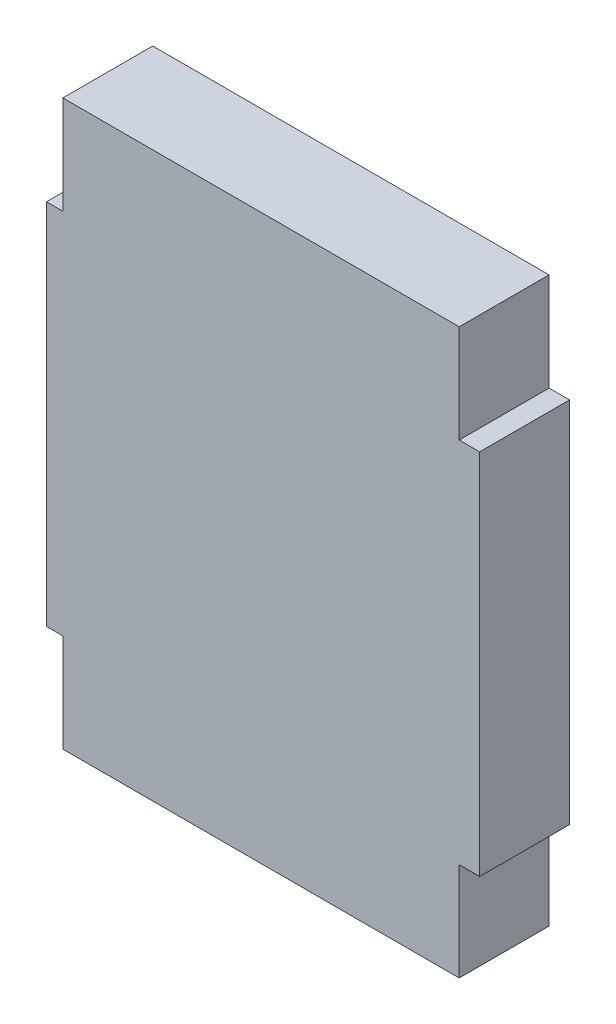
ISO-10303-21;
HEADER;
FILE_DESCRIPTION(('STEP AP214'),'2;1');
FILE_NAME('part.step','',(''),(''),'','','');
FILE_SCHEMA(('AUTOMOTIVE_DESIGN { 1 0 10303 214 1 1 1 1 }'));
ENDSEC;
DATA;
#1=APPLICATION_CONTEXT('core data for automotive mechanical design processes');
#2=APPLICATION_PROTOCOL_DEFINITION('international standard','automotive_design',2000,#1);
#3=PRODUCT_CONTEXT('',#1,'mechanical');
#4=PRODUCT('Part','Part','',(#3));
#5=PRODUCT_RELATED_PRODUCT_CATEGORY('part','',(#4));
#6=PRODUCT_DEFINITION_FORMATION('','',#4);
#7=PRODUCT_DEFINITION_CONTEXT('part definition',#1,'design');
#8=PRODUCT_DEFINITION('design','',#6,#7);
#9=PRODUCT_DEFINITION_SHAPE('','',#8);
#10=(LENGTH_UNIT() NAMED_UNIT(*) SI_UNIT(.MILLI.,.METRE.));
#11=(NAMED_UNIT(*) PLANE_ANGLE_UNIT() SI_UNIT($,.RADIAN.));
#12=(NAMED_UNIT(*) SI_UNIT($,.STERADIAN.) SOLID_ANGLE_UNIT());
#13=UNCERTAINTY_MEASURE_WITH_UNIT(LENGTH_MEASURE(1.E-05),#10,'distance_accuracy_value','');
#14=(GEOMETRIC_REPRESENTATION_CONTEXT(3) GLOBAL_UNCERTAINTY_ASSIGNED_CONTEXT((#13)) GLOBAL_UNIT_ASSIGNED_CONTEXT((#10,
#11,#12)) REPRESENTATION_CONTEXT('',''));
#15=CARTESIAN_POINT('',(0.,0.,0.));
#16=DIRECTION('',(0.,0.,1.));
#17=DIRECTION('',(1.,0.,0.));
#18=AXIS2_PLACEMENT_3D('',#15,#16,#17);
#19=CARTESIAN_POINT('',(2.675,2.25,1.1));
#20=DIRECTION('',(-1.,0.,0.));
#21=DIRECTION('',(0.,0.,1.));
#22=AXIS2_PLACEMENT_3D('',#19,#20,#21);
#23=PLANE('',#22);
#24=DIRECTION('',(0.,1.,0.));
#25=VECTOR('',#24,1.);
#26=CARTESIAN_POINT('',(2.675,2.25,0.));
#27=LINE('',#26,#25);
#28=CARTESIAN_POINT('',(2.675,-2.25,0.));
#29=VERTEX_POINT('',#28);
#30=CARTESIAN_POINT('',(2.675,2.25,0.));
#31=VERTEX_POINT('',#30);
#32=EDGE_CURVE('E154',#29,#31,#27,.T.);
#33=ORIENTED_EDGE('',*,*,#32,.T.);
#34=DIRECTION('',(0.,0.,-1.));
#35=VECTOR('',#34,1.);
#36=CARTESIAN_POINT('',(2.675,2.25,1.1));
#37=LINE('',#36,#35);
#38=CARTESIAN_POINT('',(2.675,2.25,1.1));
#39=VERTEX_POINT('',#38);
#40=EDGE_CURVE('E11',#39,#31,#37,.T.);
#41=ORIENTED_EDGE('',*,*,#40,.F.);
#42=DIRECTION('',(0.,1.,0.));
#43=VECTOR('',#42,1.);
#44=CARTESIAN_POINT('',(2.675,2.25,1.1));
#45=LINE('',#44,#43);
#46=CARTESIAN_POINT('',(2.675,-2.25,1.1));
#47=VERTEX_POINT('',#46);
#48=EDGE_CURVE('E176',#47,#39,#45,.T.);
#49=ORIENTED_EDGE('',*,*,#48,.F.);
#50=DIRECTION('',(0.,0.,-1.));
#51=VECTOR('',#50,1.);
#52=CARTESIAN_POINT('',(2.675,-2.25,1.1));
#53=LINE('',#52,#51);
#54=EDGE_CURVE('E150',#47,#29,#53,.T.);
#55=ORIENTED_EDGE('',*,*,#54,.T.);
#56=EDGE_LOOP('',(#33,#41,#49,#55));
#57=FACE_BOUND('',#56,.T.);
#58=ADVANCED_FACE('F34',(#57),#23,.F.);
#59=CARTESIAN_POINT('',(2.425,2.25,1.1));
#60=DIRECTION('',(0.,-1.,0.));
#61=DIRECTION('',(0.,0.,-1.));
#62=AXIS2_PLACEMENT_3D('',#59,#60,#61);
#63=PLANE('',#62);
#64=DIRECTION('',(-1.,0.,0.));
#65=VECTOR('',#64,1.);
#66=CARTESIAN_POINT('',(2.425,2.25,0.));
#67=LINE('',#66,#65);
#68=CARTESIAN_POINT('',(2.425,2.25,0.));
#69=VERTEX_POINT('',#68);
#70=EDGE_CURVE('E157',#31,#69,#67,.T.);
#71=ORIENTED_EDGE('',*,*,#70,.T.);
#72=DIRECTION('',(0.,0.,-1.));
#73=VECTOR('',#72,1.);
#74=CARTESIAN_POINT('',(2.425,2.25,1.1));
#75=LINE('',#74,#73);
#76=CARTESIAN_POINT('',(2.425,2.25,1.1));
#77=VERTEX_POINT('',#76);
#78=EDGE_CURVE('E42',#77,#69,#75,.T.);
#79=ORIENTED_EDGE('',*,*,#78,.F.);
#80=DIRECTION('',(-1.,0.,0.));
#81=VECTOR('',#80,1.);
#82=CARTESIAN_POINT('',(2.425,2.25,1.1));
#83=LINE('',#82,#81);
#84=EDGE_CURVE('E105',#39,#77,#83,.T.);
#85=ORIENTED_EDGE('',*,*,#84,.F.);
#86=ORIENTED_EDGE('',*,*,#40,.T.);
#87=EDGE_LOOP('',(#71,#79,#85,#86));
#88=FACE_BOUND('',#87,.T.);
#89=ADVANCED_FACE('F254',(#88),#63,.F.);
#90=CARTESIAN_POINT('',(2.425,3.45,1.1));
#91=DIRECTION('',(-1.,0.,0.));
#92=DIRECTION('',(0.,0.,1.));
#93=AXIS2_PLACEMENT_3D('',#90,#91,#92);
#94=PLANE('',#93);
#95=DIRECTION('',(0.,1.,0.));
#96=VECTOR('',#95,1.);
#97=CARTESIAN_POINT('',(2.425,3.45,0.));
#98=LINE('',#97,#96);
#99=CARTESIAN_POINT('',(2.425,3.45,0.));
#100=VERTEX_POINT('',#99);
#101=EDGE_CURVE('E159',#69,#100,#98,.T.);
#102=ORIENTED_EDGE('',*,*,#101,.T.);
#103=DIRECTION('',(0.,0.,-1.));
#104=VECTOR('',#103,1.);
#105=CARTESIAN_POINT('',(2.425,3.45,1.1));
#106=LINE('',#105,#104);
#107=CARTESIAN_POINT('',(2.425,3.45,1.1));
#108=VERTEX_POINT('',#107);
#109=EDGE_CURVE('E195',#108,#100,#106,.T.);
#110=ORIENTED_EDGE('',*,*,#109,.F.);
#111=DIRECTION('',(0.,1.,0.));
#112=VECTOR('',#111,1.);
#113=CARTESIAN_POINT('',(2.425,3.45,1.1));
#114=LINE('',#113,#112);
#115=EDGE_CURVE('E203',#77,#108,#114,.T.);
#116=ORIENTED_EDGE('',*,*,#115,.F.);
#117=ORIENTED_EDGE('',*,*,#78,.T.);
#118=EDGE_LOOP('',(#102,#110,#116,#117));
#119=FACE_BOUND('',#118,.T.);
#120=ADVANCED_FACE('F201',(#119),#94,.F.);
#121=CARTESIAN_POINT('',(-2.425,3.45,1.1));
#122=DIRECTION('',(0.,-1.,0.));
#123=DIRECTION('',(0.,0.,-1.));
#124=AXIS2_PLACEMENT_3D('',#121,#122,#123);
#125=PLANE('',#124);
#126=DIRECTION('',(-1.,0.,0.));
#127=VECTOR('',#126,1.);
#128=CARTESIAN_POINT('',(-2.425,3.45,0.));
#129=LINE('',#128,#127);
#130=CARTESIAN_POINT('',(-2.425,3.45,0.));
#131=VERTEX_POINT('',#130);
#132=EDGE_CURVE('E161',#100,#131,#129,.T.);
#133=ORIENTED_EDGE('',*,*,#132,.T.);
#134=DIRECTION('',(0.,0.,-1.));
#135=VECTOR('',#134,1.);
#136=CARTESIAN_POINT('',(-2.425,3.45,1.1));
#137=LINE('',#136,#135);
#138=CARTESIAN_POINT('',(-2.425,3.45,1.1));
#139=VERTEX_POINT('',#138);
#140=EDGE_CURVE('E192',#139,#131,#137,.T.);
#141=ORIENTED_EDGE('',*,*,#140,.F.);
#142=DIRECTION('',(-1.,0.,0.));
#143=VECTOR('',#142,1.);
#144=CARTESIAN_POINT('',(-2.425,3.45,1.1));
#145=LINE('',#144,#143);
#146=EDGE_CURVE('E221',#108,#139,#145,.T.);
#147=ORIENTED_EDGE('',*,*,#146,.F.);
#148=ORIENTED_EDGE('',*,*,#109,.T.);
#149=EDGE_LOOP('',(#133,#141,#147,#148));
#150=FACE_BOUND('',#149,.T.);
#151=ADVANCED_FACE('F212',(#150),#125,.F.);
#152=CARTESIAN_POINT('',(-2.425,2.25,1.1));
#153=DIRECTION('',(1.,0.,0.));
#154=DIRECTION('',(0.,0.,-1.));
#155=AXIS2_PLACEMENT_3D('',#152,#153,#154);
#156=PLANE('',#155);
#157=DIRECTION('',(0.,-1.,0.));
#158=VECTOR('',#157,1.);
#159=CARTESIAN_POINT('',(-2.425,2.25,0.));
#160=LINE('',#159,#158);
#161=CARTESIAN_POINT('',(-2.425,2.25,0.));
#162=VERTEX_POINT('',#161);
#163=EDGE_CURVE('E163',#131,#162,#160,.T.);
#164=ORIENTED_EDGE('',*,*,#163,.T.);
#165=DIRECTION('',(0.,0.,-1.));
#166=VECTOR('',#165,1.);
#167=CARTESIAN_POINT('',(-2.425,2.25,1.1));
#168=LINE('',#167,#166);
#169=CARTESIAN_POINT('',(-2.425,2.25,1.1));
#170=VERTEX_POINT('',#169);
#171=EDGE_CURVE('E189',#170,#162,#168,.T.);
#172=ORIENTED_EDGE('',*,*,#171,.F.);
#173=DIRECTION('',(0.,-1.,0.));
#174=VECTOR('',#173,1.);
#175=CARTESIAN_POINT('',(-2.425,2.25,1.1));
#176=LINE('',#175,#174);
#177=EDGE_CURVE('E218',#139,#170,#176,.T.);
#178=ORIENTED_EDGE('',*,*,#177,.F.);
#179=ORIENTED_EDGE('',*,*,#140,.T.);
#180=EDGE_LOOP('',(#164,#172,#178,#179));
#181=FACE_BOUND('',#180,.T.);
#182=ADVANCED_FACE('F216',(#181),#156,.F.);
#183=CARTESIAN_POINT('',(-2.625,2.25,1.1));
#184=DIRECTION('',(0.,-1.,0.));
#185=DIRECTION('',(0.,0.,-1.));
#186=AXIS2_PLACEMENT_3D('',#183,#184,#185);
#187=PLANE('',#186);
#188=DIRECTION('',(-1.,0.,0.));
#189=VECTOR('',#188,1.);
#190=CARTESIAN_POINT('',(-2.625,2.25,0.));
#191=LINE('',#190,#189);
#192=CARTESIAN_POINT('',(-2.625,2.25,0.));
#193=VERTEX_POINT('',#192);
#194=EDGE_CURVE('E165',#162,#193,#191,.T.);
#195=ORIENTED_EDGE('',*,*,#194,.T.);
#196=DIRECTION('',(0.,0.,-1.));
#197=VECTOR('',#196,1.);
#198=CARTESIAN_POINT('',(-2.625,2.25,1.1));
#199=LINE('',#198,#197);
#200=CARTESIAN_POINT('',(-2.625,2.25,1.1));
#201=VERTEX_POINT('',#200);
#202=EDGE_CURVE('E186',#201,#193,#199,.T.);
#203=ORIENTED_EDGE('',*,*,#202,.F.);
#204=DIRECTION('',(-1.,0.,0.));
#205=VECTOR('',#204,1.);
#206=CARTESIAN_POINT('',(-2.625,2.25,1.1));
#207=LINE('',#206,#205);
#208=EDGE_CURVE('E220',#170,#201,#207,.T.);
#209=ORIENTED_EDGE('',*,*,#208,.F.);
#210=ORIENTED_EDGE('',*,*,#171,.T.);
#211=EDGE_LOOP('',(#195,#203,#209,#210));
#212=FACE_BOUND('',#211,.T.);
#213=ADVANCED_FACE('F267',(#212),#187,.F.);
#214=CARTESIAN_POINT('',(-2.625,-2.25,1.1));
#215=DIRECTION('',(1.,0.,0.));
#216=DIRECTION('',(0.,0.,-1.));
#217=AXIS2_PLACEMENT_3D('',#214,#215,#216);
#218=PLANE('',#217);
#219=DIRECTION('',(0.,-1.,0.));
#220=VECTOR('',#219,1.);
#221=CARTESIAN_POINT('',(-2.625,-2.25,0.));
#222=LINE('',#221,#220);
#223=CARTESIAN_POINT('',(-2.625,-2.25,0.));
#224=VERTEX_POINT('',#223);
#225=EDGE_CURVE('E167',#193,#224,#222,.T.);
#226=ORIENTED_EDGE('',*,*,#225,.T.);
#227=DIRECTION('',(0.,0.,-1.));
#228=VECTOR('',#227,1.);
#229=CARTESIAN_POINT('',(-2.625,-2.25,1.1));
#230=LINE('',#229,#228);
#231=CARTESIAN_POINT('',(-2.625,-2.25,1.1));
#232=VERTEX_POINT('',#231);
#233=EDGE_CURVE('E183',#232,#224,#230,.T.);
#234=ORIENTED_EDGE('',*,*,#233,.F.);
#235=DIRECTION('',(0.,-1.,0.));
#236=VECTOR('',#235,1.);
#237=CARTESIAN_POINT('',(-2.625,-2.25,1.1));
#238=LINE('',#237,#236);
#239=EDGE_CURVE('E223',#201,#232,#238,.T.);
#240=ORIENTED_EDGE('',*,*,#239,.F.);
#241=ORIENTED_EDGE('',*,*,#202,.T.);
#242=EDGE_LOOP('',(#226,#234,#240,#241));
#243=FACE_BOUND('',#242,.T.);
#244=ADVANCED_FACE('F270',(#243),#218,.F.);
#245=CARTESIAN_POINT('',(-2.425,-2.25,1.1));
#246=DIRECTION('',(0.,1.,0.));
#247=DIRECTION('',(0.,0.,1.));
#248=AXIS2_PLACEMENT_3D('',#245,#246,#247);
#249=PLANE('',#248);
#250=DIRECTION('',(1.,0.,0.));
#251=VECTOR('',#250,1.);
#252=CARTESIAN_POINT('',(-2.425,-2.25,0.));
#253=LINE('',#252,#251);
#254=CARTESIAN_POINT('',(-2.425,-2.25,0.));
#255=VERTEX_POINT('',#254);
#256=EDGE_CURVE('E169',#224,#255,#253,.T.);
#257=ORIENTED_EDGE('',*,*,#256,.T.);
#258=DIRECTION('',(0.,0.,-1.));
#259=VECTOR('',#258,1.);
#260=CARTESIAN_POINT('',(-2.425,-2.25,1.1));
#261=LINE('',#260,#259);
#262=CARTESIAN_POINT('',(-2.425,-2.25,1.1));
#263=VERTEX_POINT('',#262);
#264=EDGE_CURVE('E180',#263,#255,#261,.T.);
#265=ORIENTED_EDGE('',*,*,#264,.F.);
#266=DIRECTION('',(1.,0.,0.));
#267=VECTOR('',#266,1.);
#268=CARTESIAN_POINT('',(-2.425,-2.25,1.1));
#269=LINE('',#268,#267);
#270=EDGE_CURVE('E229',#232,#263,#269,.T.);
#271=ORIENTED_EDGE('',*,*,#270,.F.);
#272=ORIENTED_EDGE('',*,*,#233,.T.);
#273=EDGE_LOOP('',(#257,#265,#271,#272));
#274=FACE_BOUND('',#273,.T.);
#275=ADVANCED_FACE('F235',(#274),#249,.F.);
#276=CARTESIAN_POINT('',(-2.425,-3.45,1.1));
#277=DIRECTION('',(1.,0.,0.));
#278=DIRECTION('',(0.,0.,-1.));
#279=AXIS2_PLACEMENT_3D('',#276,#277,#278);
#280=PLANE('',#279);
#281=DIRECTION('',(0.,-1.,0.));
#282=VECTOR('',#281,1.);
#283=CARTESIAN_POINT('',(-2.425,-3.45,0.));
#284=LINE('',#283,#282);
#285=CARTESIAN_POINT('',(-2.425,-3.45,0.));
#286=VERTEX_POINT('',#285);
#287=EDGE_CURVE('E171',#255,#286,#284,.T.);
#288=ORIENTED_EDGE('',*,*,#287,.T.);
#289=DIRECTION('',(0.,0.,-1.));
#290=VECTOR('',#289,1.);
#291=CARTESIAN_POINT('',(-2.425,-3.45,1.1));
#292=LINE('',#291,#290);
#293=CARTESIAN_POINT('',(-2.425,-3.45,1.1));
#294=VERTEX_POINT('',#293);
#295=EDGE_CURVE('E145',#294,#286,#292,.T.);
#296=ORIENTED_EDGE('',*,*,#295,.F.);
#297=DIRECTION('',(0.,-1.,0.));
#298=VECTOR('',#297,1.);
#299=CARTESIAN_POINT('',(-2.425,-3.45,1.1));
#300=LINE('',#299,#298);
#301=EDGE_CURVE('E136',#263,#294,#300,.T.);
#302=ORIENTED_EDGE('',*,*,#301,.F.);
#303=ORIENTED_EDGE('',*,*,#264,.T.);
#304=EDGE_LOOP('',(#288,#296,#302,#303));
#305=FACE_BOUND('',#304,.T.);
#306=ADVANCED_FACE('F239',(#305),#280,.F.);
#307=CARTESIAN_POINT('',(2.425,-3.45,1.1));
#308=DIRECTION('',(0.,1.,0.));
#309=DIRECTION('',(0.,0.,1.));
#310=AXIS2_PLACEMENT_3D('',#307,#308,#309);
#311=PLANE('',#310);
#312=DIRECTION('',(1.,0.,0.));
#313=VECTOR('',#312,1.);
#314=CARTESIAN_POINT('',(2.425,-3.45,0.));
#315=LINE('',#314,#313);
#316=CARTESIAN_POINT('',(2.425,-3.45,0.));
#317=VERTEX_POINT('',#316);
#318=EDGE_CURVE('E144',#286,#317,#315,.T.);
#319=ORIENTED_EDGE('',*,*,#318,.T.);
#320=DIRECTION('',(0.,0.,-1.));
#321=VECTOR('',#320,1.);
#322=CARTESIAN_POINT('',(2.425,-3.45,1.1));
#323=LINE('',#322,#321);
#324=CARTESIAN_POINT('',(2.425,-3.45,1.1));
#325=VERTEX_POINT('',#324);
#326=EDGE_CURVE('E141',#325,#317,#323,.T.);
#327=ORIENTED_EDGE('',*,*,#326,.F.);
#328=DIRECTION('',(1.,0.,0.));
#329=VECTOR('',#328,1.);
#330=CARTESIAN_POINT('',(2.425,-3.45,1.1));
#331=LINE('',#330,#329);
#332=EDGE_CURVE('E130',#294,#325,#331,.T.);
#333=ORIENTED_EDGE('',*,*,#332,.F.);
#334=ORIENTED_EDGE('',*,*,#295,.T.);
#335=EDGE_LOOP('',(#319,#327,#333,#334));
#336=FACE_BOUND('',#335,.T.);
#337=ADVANCED_FACE('F142',(#336),#311,.F.);
#338=CARTESIAN_POINT('',(2.425,-2.25,1.1));
#339=DIRECTION('',(-1.,0.,0.));
#340=DIRECTION('',(0.,0.,1.));
#341=AXIS2_PLACEMENT_3D('',#338,#339,#340);
#342=PLANE('',#341);
#343=DIRECTION('',(0.,1.,0.));
#344=VECTOR('',#343,1.);
#345=CARTESIAN_POINT('',(2.425,-2.25,0.));
#346=LINE('',#345,#344);
#347=CARTESIAN_POINT('',(2.425,-2.25,0.));
#348=VERTEX_POINT('',#347);
#349=EDGE_CURVE('E91',#317,#348,#346,.T.);
#350=ORIENTED_EDGE('',*,*,#349,.T.);
#351=DIRECTION('',(0.,0.,-1.));
#352=VECTOR('',#351,1.);
#353=CARTESIAN_POINT('',(2.425,-2.25,1.1));
#354=LINE('',#353,#352);
#355=CARTESIAN_POINT('',(2.425,-2.25,1.1));
#356=VERTEX_POINT('',#355);
#357=EDGE_CURVE('E146',#356,#348,#354,.T.);
#358=ORIENTED_EDGE('',*,*,#357,.F.);
#359=DIRECTION('',(0.,1.,0.));
#360=VECTOR('',#359,1.);
#361=CARTESIAN_POINT('',(2.425,-2.25,1.1));
#362=LINE('',#361,#360);
#363=EDGE_CURVE('E134',#325,#356,#362,.T.);
#364=ORIENTED_EDGE('',*,*,#363,.F.);
#365=ORIENTED_EDGE('',*,*,#326,.T.);
#366=EDGE_LOOP('',(#350,#358,#364,#365));
#367=FACE_BOUND('',#366,.T.);
#368=ADVANCED_FACE('F148',(#367),#342,.F.);
#369=CARTESIAN_POINT('',(2.675,-2.25,1.1));
#370=DIRECTION('',(0.,1.,0.));
#371=DIRECTION('',(0.,0.,1.));
#372=AXIS2_PLACEMENT_3D('',#369,#370,#371);
#373=PLANE('',#372);
#374=DIRECTION('',(1.,0.,0.));
#375=VECTOR('',#374,1.);
#376=CARTESIAN_POINT('',(2.675,-2.25,0.));
#377=LINE('',#376,#375);
#378=EDGE_CURVE('E97',#348,#29,#377,.T.);
#379=ORIENTED_EDGE('',*,*,#378,.T.);
#380=ORIENTED_EDGE('',*,*,#54,.F.);
#381=DIRECTION('',(1.,0.,0.));
#382=VECTOR('',#381,1.);
#383=CARTESIAN_POINT('',(2.675,-2.25,1.1));
#384=LINE('',#383,#382);
#385=EDGE_CURVE('E50',#356,#47,#384,.T.);
#386=ORIENTED_EDGE('',*,*,#385,.F.);
#387=ORIENTED_EDGE('',*,*,#357,.T.);
#388=EDGE_LOOP('',(#379,#380,#386,#387));
#389=FACE_BOUND('',#388,.T.);
#390=ADVANCED_FACE('F243',(#389),#373,.F.);
#391=CARTESIAN_POINT('',(0.,0.,1.1));
#392=DIRECTION('',(0.,0.,-1.));
#393=DIRECTION('',(-1.,0.,0.));
#394=AXIS2_PLACEMENT_3D('',#391,#392,#393);
#395=PLANE('',#394);
#396=ORIENTED_EDGE('',*,*,#48,.T.);
#397=ORIENTED_EDGE('',*,*,#84,.T.);
#398=ORIENTED_EDGE('',*,*,#115,.T.);
#399=ORIENTED_EDGE('',*,*,#146,.T.);
#400=ORIENTED_EDGE('',*,*,#177,.T.);
#401=ORIENTED_EDGE('',*,*,#208,.T.);
#402=ORIENTED_EDGE('',*,*,#239,.T.);
#403=ORIENTED_EDGE('',*,*,#270,.T.);
#404=ORIENTED_EDGE('',*,*,#301,.T.);
#405=ORIENTED_EDGE('',*,*,#332,.T.);
#406=ORIENTED_EDGE('',*,*,#363,.T.);
#407=ORIENTED_EDGE('',*,*,#385,.T.);
#408=EDGE_LOOP('',(#396,#397,#398,#399,#400,#401,#402,#403,#404,#405,#406,#407));
#409=FACE_BOUND('',#408,.T.);
#410=ADVANCED_FACE('F132',(#409),#395,.F.);
#411=CARTESIAN_POINT('',(0.,0.,0.));
#412=DIRECTION('',(0.,0.,-1.));
#413=DIRECTION('',(-1.,0.,0.));
#414=AXIS2_PLACEMENT_3D('',#411,#412,#413);
#415=PLANE('',#414);
#416=ORIENTED_EDGE('',*,*,#32,.F.);
#417=ORIENTED_EDGE('',*,*,#378,.F.);
#418=ORIENTED_EDGE('',*,*,#349,.F.);
#419=ORIENTED_EDGE('',*,*,#318,.F.);
#420=ORIENTED_EDGE('',*,*,#287,.F.);
#421=ORIENTED_EDGE('',*,*,#256,.F.);
#422=ORIENTED_EDGE('',*,*,#225,.F.);
#423=ORIENTED_EDGE('',*,*,#194,.F.);
#424=ORIENTED_EDGE('',*,*,#163,.F.);
#425=ORIENTED_EDGE('',*,*,#132,.F.);
#426=ORIENTED_EDGE('',*,*,#101,.F.);
#427=ORIENTED_EDGE('',*,*,#70,.F.);
#428=EDGE_LOOP('',(#416,#417,#418,#419,#420,#421,#422,#423,#424,#425,#426,#427));
#429=FACE_BOUND('',#428,.T.);
#430=ADVANCED_FACE('F207',(#429),#415,.T.);
#431=CLOSED_SHELL('',(#58,#89,#120,#151,#182,#213,#244,#275,#306,#337,#368,#390,#410,#430));
#432=MANIFOLD_SOLID_BREP('B2',#431);
#433=ADVANCED_BREP_SHAPE_REPRESENTATION('',(#18,#432),#14);
#434=SHAPE_DEFINITION_REPRESENTATION(#9,#433);
ENDSEC;
END-ISO-10303-21;
